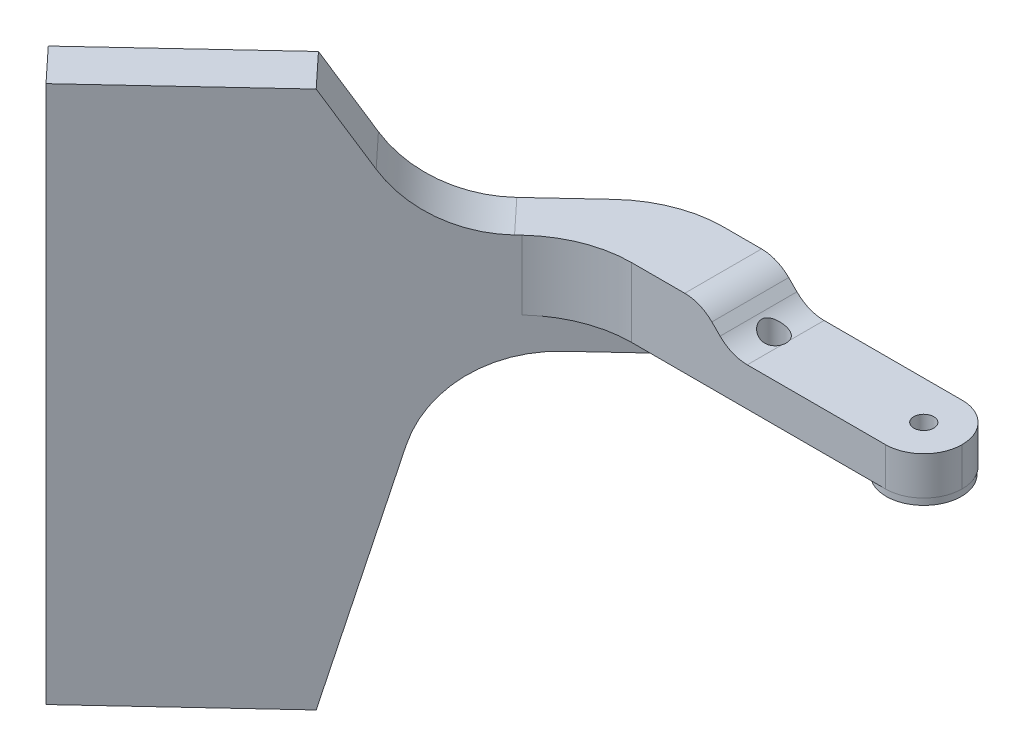
ISO-10303-21;
HEADER;
FILE_DESCRIPTION(('STEP AP214'),'2;1');
FILE_NAME('part.step','',(''),(''),'','','');
FILE_SCHEMA(('AUTOMOTIVE_DESIGN { 1 0 10303 214 1 1 1 1 }'));
ENDSEC;
DATA;
#1=APPLICATION_CONTEXT('core data for automotive mechanical design processes');
#2=APPLICATION_PROTOCOL_DEFINITION('international standard','automotive_design',2000,#1);
#3=PRODUCT_CONTEXT('',#1,'mechanical');
#4=PRODUCT('Part','Part','',(#3));
#5=PRODUCT_RELATED_PRODUCT_CATEGORY('part','',(#4));
#6=PRODUCT_DEFINITION_FORMATION('','',#4);
#7=PRODUCT_DEFINITION_CONTEXT('part definition',#1,'design');
#8=PRODUCT_DEFINITION('design','',#6,#7);
#9=PRODUCT_DEFINITION_SHAPE('','',#8);
#10=(LENGTH_UNIT() NAMED_UNIT(*) SI_UNIT(.MILLI.,.METRE.));
#11=(NAMED_UNIT(*) PLANE_ANGLE_UNIT() SI_UNIT($,.RADIAN.));
#12=(NAMED_UNIT(*) SI_UNIT($,.STERADIAN.) SOLID_ANGLE_UNIT());
#13=UNCERTAINTY_MEASURE_WITH_UNIT(LENGTH_MEASURE(1.E-05),#10,'distance_accuracy_value','');
#14=(GEOMETRIC_REPRESENTATION_CONTEXT(3) GLOBAL_UNCERTAINTY_ASSIGNED_CONTEXT((#13)) GLOBAL_UNIT_ASSIGNED_CONTEXT((#10,
#11,#12)) REPRESENTATION_CONTEXT('',''));
#15=CARTESIAN_POINT('',(0.,0.,0.));
#16=DIRECTION('',(0.,0.,1.));
#17=DIRECTION('',(1.,0.,0.));
#18=AXIS2_PLACEMENT_3D('',#15,#16,#17);
#19=CARTESIAN_POINT('',(0.,0.,0.));
#20=DIRECTION('',(0.,1.,0.));
#21=DIRECTION('',(0.,0.,1.));
#22=AXIS2_PLACEMENT_3D('',#19,#20,#21);
#23=PLANE('',#22);
#24=CARTESIAN_POINT('',(17.5,0.,-5.00000000000005));
#25=DIRECTION('',(0.,-1.,0.));
#26=DIRECTION('',(0.,0.,-1.));
#27=AXIS2_PLACEMENT_3D('',#24,#25,#26);
#28=CIRCLE('',#27,1.6);
#29=CARTESIAN_POINT('',(17.5,0.,-6.60000000000005));
#30=VERTEX_POINT('',#29);
#31=EDGE_CURVE('E196',#30,#30,#28,.T.);
#32=ORIENTED_EDGE('',*,*,#31,.F.);
#33=EDGE_LOOP('',(#32));
#34=FACE_BOUND('',#33,.T.);
#35=CARTESIAN_POINT('',(37.,0.,-4.99999999999999));
#36=DIRECTION('',(0.,1.,0.));
#37=DIRECTION('',(0.,0.,1.));
#38=AXIS2_PLACEMENT_3D('',#35,#36,#37);
#39=CIRCLE('',#38,4.9);
#40=CARTESIAN_POINT('',(37.,0.,-0.0999999999999873));
#41=VERTEX_POINT('',#40);
#42=EDGE_CURVE('E247',#41,#41,#39,.F.);
#43=ORIENTED_EDGE('',*,*,#42,.F.);
#44=EDGE_LOOP('',(#43));
#45=FACE_BOUND('',#44,.T.);
#46=DIRECTION('',(-0.731353701619174,0.,0.681998360062495));
#47=VECTOR('',#46,1.);
#48=CARTESIAN_POINT('',(-15.5899264830256,0.,12.7418064037898));
#49=LINE('',#48,#47);
#50=CARTESIAN_POINT('',(8.79767511383777,0.,-10.));
#51=VERTEX_POINT('',#50);
#52=CARTESIAN_POINT('',(-6.24733025312248,0.,4.02969447571239));
#53=VERTEX_POINT('',#52);
#54=EDGE_CURVE('E329',#51,#53,#49,.T.);
#55=ORIENTED_EDGE('',*,*,#54,.F.);
#56=DIRECTION('',(1.,0.,0.));
#57=VECTOR('',#56,1.);
#58=CARTESIAN_POINT('',(0.,0.,-10.));
#59=LINE('',#58,#57);
#60=CARTESIAN_POINT('',(37.,0.,-10.));
#61=VERTEX_POINT('',#60);
#62=EDGE_CURVE('E225',#51,#61,#59,.T.);
#63=ORIENTED_EDGE('',*,*,#62,.T.);
#64=CARTESIAN_POINT('',(37.,0.,-5.));
#65=DIRECTION('',(0.,1.,0.));
#66=DIRECTION('',(0.,0.,1.));
#67=AXIS2_PLACEMENT_3D('',#64,#65,#66);
#68=CIRCLE('',#67,5.);
#69=CARTESIAN_POINT('',(42.,0.,-5.));
#70=VERTEX_POINT('',#69);
#71=EDGE_CURVE('E235',#61,#70,#68,.F.);
#72=ORIENTED_EDGE('',*,*,#71,.T.);
#73=CARTESIAN_POINT('',(37.,0.,-5.00000000000001));
#74=DIRECTION('',(0.,1.,0.));
#75=DIRECTION('',(0.,0.,1.));
#76=AXIS2_PLACEMENT_3D('',#73,#74,#75);
#77=CIRCLE('',#76,5.);
#78=CARTESIAN_POINT('',(37.,0.,0.));
#79=VERTEX_POINT('',#78);
#80=EDGE_CURVE('E237',#70,#79,#77,.F.);
#81=ORIENTED_EDGE('',*,*,#80,.T.);
#82=DIRECTION('',(-1.,0.,0.));
#83=VECTOR('',#82,1.);
#84=CARTESIAN_POINT('',(0.,0.,0.));
#85=LINE('',#84,#83);
#86=CARTESIAN_POINT('',(3.98264514781494,0.,0.));
#87=VERTEX_POINT('',#86);
#88=EDGE_CURVE('E229',#79,#87,#85,.T.);
#89=ORIENTED_EDGE('',*,*,#88,.T.);
#90=CARTESIAN_POINT('',(3.98264514781494,0.,15.));
#91=DIRECTION('',(0.,1.,0.));
#92=DIRECTION('',(0.,0.,1.));
#93=AXIS2_PLACEMENT_3D('',#90,#91,#92);
#94=CIRCLE('',#93,15.);
#95=EDGE_CURVE('E278',#87,#53,#94,.T.);
#96=ORIENTED_EDGE('',*,*,#95,.T.);
#97=EDGE_LOOP('',(#55,#63,#72,#81,#89,#96));
#98=FACE_BOUND('',#97,.T.);
#99=ADVANCED_FACE('F40',(#34,#45,#98),#23,.F.);
#100=CARTESIAN_POINT('',(-11.0535847060781,0.,8.51159926090981));
#101=DIRECTION('',(0.705053553573808,-0.265760497297975,-0.657473075242537));
#102=DIRECTION('',(-0.681998360062495,0.,-0.731353701619174));
#103=AXIS2_PLACEMENT_3D('',#100,#101,#102);
#104=PLANE('',#103);
#105=DIRECTION('',(-0.194364923443027,-0.964039085346612,0.181248223326612));
#106=VECTOR('',#105,1.);
#107=CARTESIAN_POINT('',(-15.1455748664531,0.,4.12347705119476));
#108=LINE('',#107,#106);
#109=CARTESIAN_POINT('',(-18.1725431803942,-15.0135925405304,6.94617066920552));
#110=VERTEX_POINT('',#109);
#111=CARTESIAN_POINT('',(-24.2182584203481,-45.,12.5838913369548));
#112=VERTEX_POINT('',#111);
#113=EDGE_CURVE('E351',#110,#112,#108,.T.);
#114=ORIENTED_EDGE('',*,*,#113,.F.);
#115=DIRECTION('',(0.681998360062495,0.,0.731353701619174));
#116=VECTOR('',#115,1.);
#117=CARTESIAN_POINT('',(-14.0805530200192,-15.0135925405304,11.3342928789206));
#118=LINE('',#117,#116);
#119=CARTESIAN_POINT('',(-14.0805530200192,-15.0135925405304,11.3342928789206));
#120=VERTEX_POINT('',#119);
#121=EDGE_CURVE('E273',#110,#120,#118,.T.);
#122=ORIENTED_EDGE('',*,*,#121,.T.);
#123=DIRECTION('',(-0.194364923443027,-0.964039085346612,0.181248223326612));
#124=VECTOR('',#123,1.);
#125=CARTESIAN_POINT('',(-11.0535847060781,0.,8.51159926090981));
#126=LINE('',#125,#124);
#127=CARTESIAN_POINT('',(-20.1262682599731,-45.,16.9720135466699));
#128=VERTEX_POINT('',#127);
#129=EDGE_CURVE('E354',#120,#128,#126,.T.);
#130=ORIENTED_EDGE('',*,*,#129,.T.);
#131=DIRECTION('',(0.681998360062494,0.,0.731353701619174));
#132=VECTOR('',#131,1.);
#133=CARTESIAN_POINT('',(-20.1262682599731,-45.,16.9720135466699));
#134=LINE('',#133,#132);
#135=EDGE_CURVE('E360',#112,#128,#134,.T.);
#136=ORIENTED_EDGE('',*,*,#135,.F.);
#137=EDGE_LOOP('',(#114,#122,#130,#136));
#138=FACE_BOUND('',#137,.T.);
#139=ADVANCED_FACE('F403',(#138),#104,.T.);
#140=CARTESIAN_POINT('',(0.,5.,0.));
#141=DIRECTION('',(0.,0.,1.));
#142=DIRECTION('',(1.,0.,0.));
#143=AXIS2_PLACEMENT_3D('',#140,#141,#142);
#144=PLANE('',#143);
#145=DIRECTION('',(0.707106781186548,-0.707106781186547,0.));
#146=VECTOR('',#145,1.);
#147=CARTESIAN_POINT('',(8.4752602127433,13.4752602127433,0.));
#148=LINE('',#147,#146);
#149=CARTESIAN_POINT('',(15.4860543314193,6.46446609406726,0.));
#150=VERTEX_POINT('',#149);
#151=CARTESIAN_POINT('',(14.4149865195539,7.53553390593273,0.));
#152=VERTEX_POINT('',#151);
#153=EDGE_CURVE('E291',#150,#152,#148,.F.);
#154=ORIENTED_EDGE('',*,*,#153,.T.);
#155=CARTESIAN_POINT('',(10.8794526136211,4.,0.));
#156=DIRECTION('',(0.,0.,1.));
#157=DIRECTION('',(1.,0.,0.));
#158=AXIS2_PLACEMENT_3D('',#155,#156,#157);
#159=CIRCLE('',#158,5.);
#160=CARTESIAN_POINT('',(10.8794526136211,9.,0.));
#161=VERTEX_POINT('',#160);
#162=EDGE_CURVE('E201',#152,#161,#159,.T.);
#163=ORIENTED_EDGE('',*,*,#162,.T.);
#164=DIRECTION('',(1.,0.,0.));
#165=VECTOR('',#164,1.);
#166=CARTESIAN_POINT('',(0.,9.,0.));
#167=LINE('',#166,#165);
#168=CARTESIAN_POINT('',(3.98264514781494,9.,0.));
#169=VERTEX_POINT('',#168);
#170=EDGE_CURVE('E315',#169,#161,#167,.T.);
#171=ORIENTED_EDGE('',*,*,#170,.F.);
#172=DIRECTION('',(0.,-1.,0.));
#173=VECTOR('',#172,1.);
#174=CARTESIAN_POINT('',(3.98264514781494,5.,0.));
#175=LINE('',#174,#173);
#176=EDGE_CURVE('E268',#169,#87,#175,.T.);
#177=ORIENTED_EDGE('',*,*,#176,.T.);
#178=ORIENTED_EDGE('',*,*,#88,.F.);
#179=DIRECTION('',(0.,-1.,0.));
#180=VECTOR('',#179,1.);
#181=CARTESIAN_POINT('',(37.,5.,0.));
#182=LINE('',#181,#180);
#183=CARTESIAN_POINT('',(37.,5.,0.));
#184=VERTEX_POINT('',#183);
#185=EDGE_CURVE('E239',#79,#184,#182,.F.);
#186=ORIENTED_EDGE('',*,*,#185,.T.);
#187=DIRECTION('',(-1.,0.,0.));
#188=VECTOR('',#187,1.);
#189=CARTESIAN_POINT('',(0.,5.,0.));
#190=LINE('',#189,#188);
#191=CARTESIAN_POINT('',(19.0215882373521,5.,0.));
#192=VERTEX_POINT('',#191);
#193=EDGE_CURVE('E221',#184,#192,#190,.T.);
#194=ORIENTED_EDGE('',*,*,#193,.T.);
#195=CARTESIAN_POINT('',(19.0215882373521,10.,0.));
#196=DIRECTION('',(0.,0.,1.));
#197=DIRECTION('',(1.,0.,0.));
#198=AXIS2_PLACEMENT_3D('',#195,#196,#197);
#199=CIRCLE('',#198,5.);
#200=EDGE_CURVE('E199',#192,#150,#199,.F.);
#201=ORIENTED_EDGE('',*,*,#200,.T.);
#202=EDGE_LOOP('',(#154,#163,#171,#177,#178,#186,#194,#201));
#203=FACE_BOUND('',#202,.T.);
#204=ADVANCED_FACE('F308',(#203),#144,.T.);
#205=CARTESIAN_POINT('',(0.,5.,-10.));
#206=DIRECTION('',(0.,0.,-1.));
#207=DIRECTION('',(-1.,0.,0.));
#208=AXIS2_PLACEMENT_3D('',#205,#206,#207);
#209=PLANE('',#208);
#210=DIRECTION('',(-1.,0.,0.));
#211=VECTOR('',#210,1.);
#212=CARTESIAN_POINT('',(0.,9.,-10.));
#213=LINE('',#212,#211);
#214=CARTESIAN_POINT('',(10.8794526136211,9.,-10.));
#215=VERTEX_POINT('',#214);
#216=CARTESIAN_POINT('',(5.90865713422409,9.,-10.));
#217=VERTEX_POINT('',#216);
#218=EDGE_CURVE('E195',#215,#217,#213,.T.);
#219=ORIENTED_EDGE('',*,*,#218,.F.);
#220=CARTESIAN_POINT('',(10.8794526136211,4.,-10.));
#221=DIRECTION('',(0.,0.,-1.));
#222=DIRECTION('',(-1.,0.,0.));
#223=AXIS2_PLACEMENT_3D('',#220,#221,#222);
#224=CIRCLE('',#223,5.);
#225=CARTESIAN_POINT('',(14.4149865195539,7.53553390593273,-10.));
#226=VERTEX_POINT('',#225);
#227=EDGE_CURVE('E298',#215,#226,#224,.T.);
#228=ORIENTED_EDGE('',*,*,#227,.T.);
#229=DIRECTION('',(-0.707106781186548,0.707106781186547,0.));
#230=VECTOR('',#229,1.);
#231=CARTESIAN_POINT('',(8.4752602127433,13.4752602127433,-10.));
#232=LINE('',#231,#230);
#233=CARTESIAN_POINT('',(15.4860543314193,6.46446609406726,-10.));
#234=VERTEX_POINT('',#233);
#235=EDGE_CURVE('E216',#226,#234,#232,.F.);
#236=ORIENTED_EDGE('',*,*,#235,.T.);
#237=CARTESIAN_POINT('',(19.0215882373521,10.,-10.));
#238=DIRECTION('',(0.,0.,-1.));
#239=DIRECTION('',(-1.,0.,0.));
#240=AXIS2_PLACEMENT_3D('',#237,#238,#239);
#241=CIRCLE('',#240,5.);
#242=CARTESIAN_POINT('',(19.0215882373521,5.,-10.));
#243=VERTEX_POINT('',#242);
#244=EDGE_CURVE('E54',#234,#243,#241,.F.);
#245=ORIENTED_EDGE('',*,*,#244,.T.);
#246=DIRECTION('',(1.,0.,0.));
#247=VECTOR('',#246,1.);
#248=CARTESIAN_POINT('',(0.,5.,-10.));
#249=LINE('',#248,#247);
#250=CARTESIAN_POINT('',(37.,5.,-10.));
#251=VERTEX_POINT('',#250);
#252=EDGE_CURVE('E213',#243,#251,#249,.T.);
#253=ORIENTED_EDGE('',*,*,#252,.T.);
#254=DIRECTION('',(0.,-1.,0.));
#255=VECTOR('',#254,1.);
#256=CARTESIAN_POINT('',(37.,0.,-10.));
#257=LINE('',#256,#255);
#258=EDGE_CURVE('E245',#251,#61,#257,.T.);
#259=ORIENTED_EDGE('',*,*,#258,.T.);
#260=ORIENTED_EDGE('',*,*,#62,.F.);
#261=DIRECTION('',(0.,1.,0.));
#262=VECTOR('',#261,1.);
#263=CARTESIAN_POINT('',(8.79767511383777,-4.,-10.));
#264=LINE('',#263,#262);
#265=CARTESIAN_POINT('',(8.79767511383777,-4.,-10.));
#266=VERTEX_POINT('',#265);
#267=EDGE_CURVE('E338',#266,#51,#264,.T.);
#268=ORIENTED_EDGE('',*,*,#267,.F.);
#269=DIRECTION('',(1.,0.,0.));
#270=VECTOR('',#269,1.);
#271=CARTESIAN_POINT('',(8.79767511383777,-4.,-10.));
#272=LINE('',#271,#270);
#273=CARTESIAN_POINT('',(5.90865713422409,-4.,-10.));
#274=VERTEX_POINT('',#273);
#275=EDGE_CURVE('E330',#274,#266,#272,.T.);
#276=ORIENTED_EDGE('',*,*,#275,.F.);
#277=DIRECTION('',(0.,-1.,0.));
#278=VECTOR('',#277,1.);
#279=CARTESIAN_POINT('',(5.90865713422409,9.,-10.));
#280=LINE('',#279,#278);
#281=EDGE_CURVE('E260',#274,#217,#280,.F.);
#282=ORIENTED_EDGE('',*,*,#281,.T.);
#283=EDGE_LOOP('',(#219,#228,#236,#245,#253,#259,#260,#268,#276,#282));
#284=FACE_BOUND('',#283,.T.);
#285=ADVANCED_FACE('F211',(#284),#209,.T.);
#286=CARTESIAN_POINT('',(-4.98782025129912,5.,-5.34878236872068));
#287=DIRECTION('',(0.681998360062495,0.,0.731353701619174));
#288=DIRECTION('',(0.731353701619174,0.,-0.681998360062495));
#289=AXIS2_PLACEMENT_3D('',#286,#287,#288);
#290=PLANE('',#289);
#291=DIRECTION('',(-0.731353701619174,0.,0.681998360062495));
#292=VECTOR('',#291,1.);
#293=CARTESIAN_POINT('',(-4.98782025129912,9.,-5.34878236872068));
#294=LINE('',#293,#292);
#295=CARTESIAN_POINT('',(-4.32131826671333,9.,-5.97030552428761));
#296=VERTEX_POINT('',#295);
#297=CARTESIAN_POINT('',(-10.8553641588959,9.,0.122790843688388));
#298=VERTEX_POINT('',#297);
#299=EDGE_CURVE('E319',#296,#298,#294,.T.);
#300=ORIENTED_EDGE('',*,*,#299,.F.);
#301=DIRECTION('',(0.,-1.,0.));
#302=VECTOR('',#301,1.);
#303=CARTESIAN_POINT('',(-4.32131826671333,-4.,-5.97030552428761));
#304=LINE('',#303,#302);
#305=CARTESIAN_POINT('',(-4.32131826671333,-4.,-5.97030552428761));
#306=VERTEX_POINT('',#305);
#307=EDGE_CURVE('E253',#296,#306,#304,.T.);
#308=ORIENTED_EDGE('',*,*,#307,.T.);
#309=DIRECTION('',(0.731353701619174,0.,-0.681998360062495));
#310=VECTOR('',#309,1.);
#311=CARTESIAN_POINT('',(0.,-4.,-10.));
#312=LINE('',#311,#310);
#313=CARTESIAN_POINT('',(-7.5967398767871,-4.,-2.91592545943254));
#314=VERTEX_POINT('',#313);
#315=EDGE_CURVE('E335',#314,#306,#312,.T.);
#316=ORIENTED_EDGE('',*,*,#315,.F.);
#317=CARTESIAN_POINT('',(-7.5967398767871,-19.,-2.91592545943254));
#318=DIRECTION('',(0.681998360062495,0.,0.731353701619174));
#319=DIRECTION('',(0.731353701619174,0.,-0.681998360062495));
#320=AXIS2_PLACEMENT_3D('',#317,#318,#319);
#321=CIRCLE('',#320,15.);
#322=EDGE_CURVE('E285',#314,#110,#321,.T.);
#323=ORIENTED_EDGE('',*,*,#322,.T.);
#324=ORIENTED_EDGE('',*,*,#113,.T.);
#325=DIRECTION('',(0.731353701619174,0.,-0.681998360062495));
#326=VECTOR('',#325,1.);
#327=CARTESIAN_POINT('',(-24.2182584203481,-45.,12.5838913369548));
#328=LINE('',#327,#326);
#329=CARTESIAN_POINT('',(-42.4185146939121,-45.,29.5559048836247));
#330=VERTEX_POINT('',#329);
#331=EDGE_CURVE('E356',#330,#112,#328,.T.);
#332=ORIENTED_EDGE('',*,*,#331,.F.);
#333=DIRECTION('',(0.,-1.,0.));
#334=VECTOR('',#333,1.);
#335=CARTESIAN_POINT('',(-42.4185146939121,5.,29.5559048836247));
#336=LINE('',#335,#334);
#337=CARTESIAN_POINT('',(-42.4185146939121,25.,29.5559048836247));
#338=VERTEX_POINT('',#337);
#339=EDGE_CURVE('E223',#338,#330,#336,.T.);
#340=ORIENTED_EDGE('',*,*,#339,.F.);
#341=DIRECTION('',(-0.731353701619174,0.,0.681998360062495));
#342=VECTOR('',#341,1.);
#343=CARTESIAN_POINT('',(-24.2182584203481,25.,12.5838913369548));
#344=LINE('',#343,#342);
#345=CARTESIAN_POINT('',(-24.2182584203481,25.,12.5838913369548));
#346=VERTEX_POINT('',#345);
#347=EDGE_CURVE('E369',#346,#338,#344,.T.);
#348=ORIENTED_EDGE('',*,*,#347,.F.);
#349=DIRECTION('',(0.385498897170092,-0.84980126305539,-0.359483537300538));
#350=VECTOR('',#349,1.);
#351=CARTESIAN_POINT('',(-15.1455748664531,5.,4.12347705119476));
#352=LINE('',#351,#350);
#353=CARTESIAN_POINT('',(-20.177943649539,16.0934515751417,8.81623686043057));
#354=VERTEX_POINT('',#353);
#355=EDGE_CURVE('E347',#346,#354,#352,.T.);
#356=ORIENTED_EDGE('',*,*,#355,.T.);
#357=CARTESIAN_POINT('',(-10.8553641588959,24.,0.122790843688387));
#358=DIRECTION('',(0.681998360062495,0.,0.731353701619174));
#359=DIRECTION('',(0.731353701619174,0.,-0.681998360062495));
#360=AXIS2_PLACEMENT_3D('',#357,#358,#359);
#361=CIRCLE('',#360,15.);
#362=EDGE_CURVE('E289',#354,#298,#361,.T.);
#363=ORIENTED_EDGE('',*,*,#362,.T.);
#364=EDGE_LOOP('',(#300,#308,#316,#323,#324,#332,#340,#348,#356,#363));
#365=FACE_BOUND('',#364,.T.);
#366=ADVANCED_FACE('F416',(#365),#290,.F.);
#367=CARTESIAN_POINT('',(-37.430694442613,5.,34.9046872523454));
#368=DIRECTION('',(0.731353701619174,0.,-0.681998360062495));
#369=DIRECTION('',(-0.681998360062495,0.,-0.731353701619174));
#370=AXIS2_PLACEMENT_3D('',#367,#368,#369);
#371=PLANE('',#370);
#372=ORIENTED_EDGE('',*,*,#339,.T.);
#373=DIRECTION('',(-0.681998360062496,0.,-0.731353701619173));
#374=VECTOR('',#373,1.);
#375=CARTESIAN_POINT('',(-42.4185146939121,-45.,29.5559048836247));
#376=LINE('',#375,#374);
#377=CARTESIAN_POINT('',(-38.3265245335371,-45.,33.9440270933397));
#378=VERTEX_POINT('',#377);
#379=EDGE_CURVE('E366',#378,#330,#376,.T.);
#380=ORIENTED_EDGE('',*,*,#379,.F.);
#381=DIRECTION('',(0.,-1.,0.));
#382=VECTOR('',#381,1.);
#383=CARTESIAN_POINT('',(-38.3265245335371,5.,33.9440270933397));
#384=LINE('',#383,#382);
#385=CARTESIAN_POINT('',(-38.3265245335371,25.,33.9440270933397));
#386=VERTEX_POINT('',#385);
#387=EDGE_CURVE('E220',#386,#378,#384,.T.);
#388=ORIENTED_EDGE('',*,*,#387,.F.);
#389=DIRECTION('',(0.681998360062496,0.,0.731353701619173));
#390=VECTOR('',#389,1.);
#391=CARTESIAN_POINT('',(-42.4185146939121,25.,29.5559048836247));
#392=LINE('',#391,#390);
#393=EDGE_CURVE('E372',#338,#386,#392,.T.);
#394=ORIENTED_EDGE('',*,*,#393,.F.);
#395=EDGE_LOOP('',(#372,#380,#388,#394));
#396=FACE_BOUND('',#395,.T.);
#397=ADVANCED_FACE('F398',(#396),#371,.F.);
#398=CARTESIAN_POINT('',(-0.895830090924156,5.,-0.960660159005641));
#399=DIRECTION('',(-0.681998360062495,0.,-0.731353701619174));
#400=DIRECTION('',(-0.731353701619174,0.,0.681998360062495));
#401=AXIS2_PLACEMENT_3D('',#398,#399,#400);
#402=PLANE('',#401);
#403=ORIENTED_EDGE('',*,*,#54,.T.);
#404=DIRECTION('',(0.,-1.,0.));
#405=VECTOR('',#404,1.);
#406=CARTESIAN_POINT('',(-6.24733025312248,5.,4.02969447571239));
#407=LINE('',#406,#405);
#408=CARTESIAN_POINT('',(-6.24733025312248,9.,4.02969447571239));
#409=VERTEX_POINT('',#408);
#410=EDGE_CURVE('E271',#53,#409,#407,.F.);
#411=ORIENTED_EDGE('',*,*,#410,.T.);
#412=DIRECTION('',(0.731353701619174,0.,-0.681998360062495));
#413=VECTOR('',#412,1.);
#414=CARTESIAN_POINT('',(-0.895830090924156,9.,-0.960660159005641));
#415=LINE('',#414,#413);
#416=CARTESIAN_POINT('',(-6.76337399852093,9.,4.51091305340342));
#417=VERTEX_POINT('',#416);
#418=EDGE_CURVE('E322',#417,#409,#415,.T.);
#419=ORIENTED_EDGE('',*,*,#418,.F.);
#420=CARTESIAN_POINT('',(-6.76337399852093,24.,4.51091305340342));
#421=DIRECTION('',(-0.681998360062495,0.,-0.731353701619174));
#422=DIRECTION('',(-0.731353701619174,0.,0.681998360062495));
#423=AXIS2_PLACEMENT_3D('',#420,#421,#422);
#424=CIRCLE('',#423,15.);
#425=CARTESIAN_POINT('',(-16.0859534891641,16.0934515751417,13.2043590701456));
#426=VERTEX_POINT('',#425);
#427=EDGE_CURVE('E287',#417,#426,#424,.T.);
#428=ORIENTED_EDGE('',*,*,#427,.T.);
#429=DIRECTION('',(0.385498897170092,-0.84980126305539,-0.359483537300538));
#430=VECTOR('',#429,1.);
#431=CARTESIAN_POINT('',(-11.0535847060781,5.,8.51159926090981));
#432=LINE('',#431,#430);
#433=CARTESIAN_POINT('',(-20.1262682599731,25.,16.9720135466699));
#434=VERTEX_POINT('',#433);
#435=EDGE_CURVE('E348',#434,#426,#432,.T.);
#436=ORIENTED_EDGE('',*,*,#435,.F.);
#437=DIRECTION('',(0.731353701619174,0.,-0.681998360062495));
#438=VECTOR('',#437,1.);
#439=CARTESIAN_POINT('',(-38.3265245335371,25.,33.9440270933397));
#440=LINE('',#439,#438);
#441=EDGE_CURVE('E375',#386,#434,#440,.T.);
#442=ORIENTED_EDGE('',*,*,#441,.F.);
#443=ORIENTED_EDGE('',*,*,#387,.T.);
#444=DIRECTION('',(-0.731353701619174,0.,0.681998360062494));
#445=VECTOR('',#444,1.);
#446=CARTESIAN_POINT('',(-38.3265245335371,-45.,33.9440270933397));
#447=LINE('',#446,#445);
#448=EDGE_CURVE('E363',#128,#378,#447,.T.);
#449=ORIENTED_EDGE('',*,*,#448,.F.);
#450=ORIENTED_EDGE('',*,*,#129,.F.);
#451=CARTESIAN_POINT('',(-3.50474971641214,-19.,1.4721967502825));
#452=DIRECTION('',(-0.681998360062495,0.,-0.731353701619174));
#453=DIRECTION('',(-0.731353701619174,0.,0.681998360062495));
#454=AXIS2_PLACEMENT_3D('',#451,#452,#453);
#455=CIRCLE('',#454,15.);
#456=CARTESIAN_POINT('',(-3.50474971641213,-4.,1.47219675028249));
#457=VERTEX_POINT('',#456);
#458=EDGE_CURVE('E283',#120,#457,#455,.T.);
#459=ORIENTED_EDGE('',*,*,#458,.T.);
#460=DIRECTION('',(-0.731353701619174,0.,0.681998360062495));
#461=VECTOR('',#460,1.);
#462=CARTESIAN_POINT('',(-15.5899264830256,-4.,12.7418064037898));
#463=LINE('',#462,#461);
#464=EDGE_CURVE('E332',#266,#457,#463,.T.);
#465=ORIENTED_EDGE('',*,*,#464,.F.);
#466=ORIENTED_EDGE('',*,*,#267,.T.);
#467=EDGE_LOOP('',(#403,#411,#419,#428,#436,#442,#443,#449,#450,#459,#465,#466));
#468=FACE_BOUND('',#467,.T.);
#469=ADVANCED_FACE('F387',(#468),#402,.F.);
#470=CARTESIAN_POINT('',(0.,5.,0.));
#471=DIRECTION('',(0.,1.,0.));
#472=DIRECTION('',(0.,0.,1.));
#473=AXIS2_PLACEMENT_3D('',#470,#471,#472);
#474=PLANE('',#473);
#475=CARTESIAN_POINT('',(17.5,5.,-5.00000000000005));
#476=DIRECTION('',(0.,1.,0.));
#477=DIRECTION('',(0.,0.,1.));
#478=AXIS2_PLACEMENT_3D('',#475,#476,#477);
#479=CIRCLE('',#478,1.6);
#480=CARTESIAN_POINT('',(19.0215882373521,5.,-4.50525841497637));
#481=VERTEX_POINT('',#480);
#482=CARTESIAN_POINT('',(19.0215882373521,5.,-5.49474158502373));
#483=VERTEX_POINT('',#482);
#484=EDGE_CURVE('E60',#481,#483,#479,.T.);
#485=ORIENTED_EDGE('',*,*,#484,.F.);
#486=DIRECTION('',(0.,0.,-1.));
#487=VECTOR('',#486,1.);
#488=CARTESIAN_POINT('',(19.0215882373521,5.,0.));
#489=LINE('',#488,#487);
#490=EDGE_CURVE('E66',#481,#192,#489,.F.);
#491=ORIENTED_EDGE('',*,*,#490,.T.);
#492=ORIENTED_EDGE('',*,*,#193,.F.);
#493=CARTESIAN_POINT('',(37.,5.,-5.00000000000001));
#494=DIRECTION('',(0.,1.,0.));
#495=DIRECTION('',(0.,0.,1.));
#496=AXIS2_PLACEMENT_3D('',#493,#494,#495);
#497=CIRCLE('',#496,5.);
#498=CARTESIAN_POINT('',(42.,5.,-5.));
#499=VERTEX_POINT('',#498);
#500=EDGE_CURVE('E243',#184,#499,#497,.T.);
#501=ORIENTED_EDGE('',*,*,#500,.T.);
#502=CARTESIAN_POINT('',(37.,5.,-5.));
#503=DIRECTION('',(0.,1.,0.));
#504=DIRECTION('',(0.,0.,1.));
#505=AXIS2_PLACEMENT_3D('',#502,#503,#504);
#506=CIRCLE('',#505,5.);
#507=EDGE_CURVE('E218',#499,#251,#506,.T.);
#508=ORIENTED_EDGE('',*,*,#507,.T.);
#509=ORIENTED_EDGE('',*,*,#252,.F.);
#510=EDGE_CURVE('E194',#243,#483,#489,.F.);
#511=ORIENTED_EDGE('',*,*,#510,.T.);
#512=EDGE_LOOP('',(#485,#491,#492,#501,#508,#509,#511));
#513=FACE_BOUND('',#512,.T.);
#514=CARTESIAN_POINT('',(37.,5.,-4.99999999999999));
#515=DIRECTION('',(0.,1.,0.));
#516=DIRECTION('',(0.,0.,1.));
#517=AXIS2_PLACEMENT_3D('',#514,#515,#516);
#518=CIRCLE('',#517,1.29999999999999);
#519=CARTESIAN_POINT('',(37.,5.,-3.69999999999999));
#520=VERTEX_POINT('',#519);
#521=EDGE_CURVE('E250',#520,#520,#518,.T.);
#522=ORIENTED_EDGE('',*,*,#521,.F.);
#523=EDGE_LOOP('',(#522));
#524=FACE_BOUND('',#523,.T.);
#525=ADVANCED_FACE('F191',(#513,#524),#474,.T.);
#526=CARTESIAN_POINT('',(37.,5.,-5.));
#527=DIRECTION('',(0.,1.,0.));
#528=DIRECTION('',(0.,0.,1.));
#529=AXIS2_PLACEMENT_3D('',#526,#527,#528);
#530=CYLINDRICAL_SURFACE('',#529,5.);
#531=ORIENTED_EDGE('',*,*,#258,.F.);
#532=ORIENTED_EDGE('',*,*,#507,.F.);
#533=DIRECTION('',(0.,-1.,0.));
#534=VECTOR('',#533,1.);
#535=CARTESIAN_POINT('',(42.,5.,-5.));
#536=LINE('',#535,#534);
#537=EDGE_CURVE('E232',#70,#499,#536,.F.);
#538=ORIENTED_EDGE('',*,*,#537,.F.);
#539=ORIENTED_EDGE('',*,*,#71,.F.);
#540=EDGE_LOOP('',(#531,#532,#538,#539));
#541=FACE_BOUND('',#540,.T.);
#542=ADVANCED_FACE('F386',(#541),#530,.T.);
#543=CARTESIAN_POINT('',(37.,5.,-5.00000000000001));
#544=DIRECTION('',(0.,1.,0.));
#545=DIRECTION('',(0.,0.,1.));
#546=AXIS2_PLACEMENT_3D('',#543,#544,#545);
#547=CYLINDRICAL_SURFACE('',#546,5.);
#548=ORIENTED_EDGE('',*,*,#500,.F.);
#549=ORIENTED_EDGE('',*,*,#185,.F.);
#550=ORIENTED_EDGE('',*,*,#80,.F.);
#551=ORIENTED_EDGE('',*,*,#537,.T.);
#552=EDGE_LOOP('',(#548,#549,#550,#551));
#553=FACE_BOUND('',#552,.T.);
#554=ADVANCED_FACE('F394',(#553),#547,.T.);
#555=CARTESIAN_POINT('',(37.,-5.,-4.99999999999999));
#556=DIRECTION('',(0.,1.,0.));
#557=DIRECTION('',(0.,0.,1.));
#558=AXIS2_PLACEMENT_3D('',#555,#556,#557);
#559=CYLINDRICAL_SURFACE('',#558,1.29999999999999);
#560=ORIENTED_EDGE('',*,*,#521,.T.);
#561=EDGE_LOOP('',(#560));
#562=FACE_BOUND('',#561,.T.);
#563=CARTESIAN_POINT('',(37.,-0.9,-4.99999999999999));
#564=DIRECTION('',(0.,-1.,0.));
#565=DIRECTION('',(0.,0.,-1.));
#566=AXIS2_PLACEMENT_3D('',#563,#564,#565);
#567=CIRCLE('',#566,1.29999999999999);
#568=CARTESIAN_POINT('',(37.,-0.9,-6.29999999999998));
#569=VERTEX_POINT('',#568);
#570=EDGE_CURVE('E341',#569,#569,#567,.T.);
#571=ORIENTED_EDGE('',*,*,#570,.T.);
#572=EDGE_LOOP('',(#571));
#573=FACE_BOUND('',#572,.T.);
#574=ADVANCED_FACE('F383',(#562,#573),#559,.F.);
#575=CARTESIAN_POINT('',(0.,25.,0.));
#576=DIRECTION('',(0.,1.,0.));
#577=DIRECTION('',(0.,0.,1.));
#578=AXIS2_PLACEMENT_3D('',#575,#576,#577);
#579=PLANE('',#578);
#580=ORIENTED_EDGE('',*,*,#347,.T.);
#581=ORIENTED_EDGE('',*,*,#393,.T.);
#582=ORIENTED_EDGE('',*,*,#441,.T.);
#583=DIRECTION('',(-0.681998360062495,0.,-0.731353701619174));
#584=VECTOR('',#583,1.);
#585=CARTESIAN_POINT('',(-20.1262682599731,25.,16.9720135466699));
#586=LINE('',#585,#584);
#587=EDGE_CURVE('E378',#434,#346,#586,.T.);
#588=ORIENTED_EDGE('',*,*,#587,.T.);
#589=EDGE_LOOP('',(#580,#581,#582,#588));
#590=FACE_BOUND('',#589,.T.);
#591=ADVANCED_FACE('F475',(#590),#579,.T.);
#592=CARTESIAN_POINT('',(0.,-45.,0.));
#593=DIRECTION('',(0.,1.,0.));
#594=DIRECTION('',(0.,0.,1.));
#595=AXIS2_PLACEMENT_3D('',#592,#593,#594);
#596=PLANE('',#595);
#597=ORIENTED_EDGE('',*,*,#331,.T.);
#598=ORIENTED_EDGE('',*,*,#135,.T.);
#599=ORIENTED_EDGE('',*,*,#448,.T.);
#600=ORIENTED_EDGE('',*,*,#379,.T.);
#601=EDGE_LOOP('',(#597,#598,#599,#600));
#602=FACE_BOUND('',#601,.T.);
#603=ADVANCED_FACE('F470',(#602),#596,.F.);
#604=CARTESIAN_POINT('',(-11.0535847060781,5.,8.51159926090981));
#605=DIRECTION('',(0.621505299376209,0.527103228323888,-0.579563067782812));
#606=DIRECTION('',(-0.681998360062495,0.,-0.731353701619174));
#607=AXIS2_PLACEMENT_3D('',#604,#605,#606);
#608=PLANE('',#607);
#609=ORIENTED_EDGE('',*,*,#435,.T.);
#610=DIRECTION('',(0.681998360062495,0.,0.731353701619174));
#611=VECTOR('',#610,1.);
#612=CARTESIAN_POINT('',(-20.177943649539,16.0934515751417,8.81623686043057));
#613=LINE('',#612,#611);
#614=EDGE_CURVE('E276',#426,#354,#613,.F.);
#615=ORIENTED_EDGE('',*,*,#614,.T.);
#616=ORIENTED_EDGE('',*,*,#355,.F.);
#617=ORIENTED_EDGE('',*,*,#587,.F.);
#618=EDGE_LOOP('',(#609,#615,#616,#617));
#619=FACE_BOUND('',#618,.T.);
#620=ADVANCED_FACE('F464',(#619),#608,.T.);
#621=CARTESIAN_POINT('',(37.,-0.9,-4.99999999999999));
#622=DIRECTION('',(0.,-1.,0.));
#623=DIRECTION('',(0.,0.,-1.));
#624=AXIS2_PLACEMENT_3D('',#621,#622,#623);
#625=PLANE('',#624);
#626=CARTESIAN_POINT('',(37.,-0.9,-4.99999999999999));
#627=DIRECTION('',(0.,-1.,0.));
#628=DIRECTION('',(0.,0.,-1.));
#629=AXIS2_PLACEMENT_3D('',#626,#627,#628);
#630=CIRCLE('',#629,4.9);
#631=CARTESIAN_POINT('',(37.,-0.9,-9.89999999999999));
#632=VERTEX_POINT('',#631);
#633=EDGE_CURVE('E344',#632,#632,#630,.T.);
#634=ORIENTED_EDGE('',*,*,#633,.T.);
#635=EDGE_LOOP('',(#634));
#636=FACE_BOUND('',#635,.T.);
#637=ORIENTED_EDGE('',*,*,#570,.F.);
#638=EDGE_LOOP('',(#637));
#639=FACE_BOUND('',#638,.T.);
#640=ADVANCED_FACE('F461',(#636,#639),#625,.T.);
#641=CARTESIAN_POINT('',(37.,-0.9,-4.99999999999999));
#642=DIRECTION('',(0.,1.,0.));
#643=DIRECTION('',(0.,0.,1.));
#644=AXIS2_PLACEMENT_3D('',#641,#642,#643);
#645=CYLINDRICAL_SURFACE('',#644,4.9);
#646=ORIENTED_EDGE('',*,*,#633,.F.);
#647=EDGE_LOOP('',(#646));
#648=FACE_BOUND('',#647,.T.);
#649=ORIENTED_EDGE('',*,*,#42,.T.);
#650=EDGE_LOOP('',(#649));
#651=FACE_BOUND('',#650,.T.);
#652=ADVANCED_FACE('F459',(#648,#651),#645,.T.);
#653=CARTESIAN_POINT('',(0.,-4.,0.));
#654=DIRECTION('',(0.,1.,0.));
#655=DIRECTION('',(0.,0.,1.));
#656=AXIS2_PLACEMENT_3D('',#653,#654,#655);
#657=PLANE('',#656);
#658=ORIENTED_EDGE('',*,*,#315,.T.);
#659=CARTESIAN_POINT('',(5.90865713422409,-4.,5.));
#660=DIRECTION('',(0.,1.,0.));
#661=DIRECTION('',(0.,0.,1.));
#662=AXIS2_PLACEMENT_3D('',#659,#660,#661);
#663=CIRCLE('',#662,15.);
#664=EDGE_CURVE('E258',#306,#274,#663,.F.);
#665=ORIENTED_EDGE('',*,*,#664,.T.);
#666=ORIENTED_EDGE('',*,*,#275,.T.);
#667=ORIENTED_EDGE('',*,*,#464,.T.);
#668=DIRECTION('',(0.681998360062495,0.,0.731353701619174));
#669=VECTOR('',#668,1.);
#670=CARTESIAN_POINT('',(-2.60891962548798,-4.,2.43285690928814));
#671=LINE('',#670,#669);
#672=EDGE_CURVE('E256',#457,#314,#671,.F.);
#673=ORIENTED_EDGE('',*,*,#672,.T.);
#674=EDGE_LOOP('',(#658,#665,#666,#667,#673));
#675=FACE_BOUND('',#674,.T.);
#676=ADVANCED_FACE('F456',(#675),#657,.F.);
#677=CARTESIAN_POINT('',(0.,9.,0.));
#678=DIRECTION('',(0.,1.,0.));
#679=DIRECTION('',(0.,0.,1.));
#680=AXIS2_PLACEMENT_3D('',#677,#678,#679);
#681=PLANE('',#680);
#682=ORIENTED_EDGE('',*,*,#170,.T.);
#683=DIRECTION('',(0.,0.,1.));
#684=VECTOR('',#683,1.);
#685=CARTESIAN_POINT('',(10.8794526136211,9.,0.));
#686=LINE('',#685,#684);
#687=EDGE_CURVE('E295',#161,#215,#686,.F.);
#688=ORIENTED_EDGE('',*,*,#687,.T.);
#689=ORIENTED_EDGE('',*,*,#218,.T.);
#690=CARTESIAN_POINT('',(5.90865713422409,9.,5.));
#691=DIRECTION('',(0.,1.,0.));
#692=DIRECTION('',(0.,0.,1.));
#693=AXIS2_PLACEMENT_3D('',#690,#691,#692);
#694=CIRCLE('',#693,15.);
#695=EDGE_CURVE('E266',#217,#296,#694,.T.);
#696=ORIENTED_EDGE('',*,*,#695,.T.);
#697=ORIENTED_EDGE('',*,*,#299,.T.);
#698=DIRECTION('',(0.681998360062495,0.,0.731353701619174));
#699=VECTOR('',#698,1.);
#700=CARTESIAN_POINT('',(-6.76337399852093,9.,4.51091305340343));
#701=LINE('',#700,#699);
#702=EDGE_CURVE('E263',#298,#417,#701,.T.);
#703=ORIENTED_EDGE('',*,*,#702,.T.);
#704=ORIENTED_EDGE('',*,*,#418,.T.);
#705=CARTESIAN_POINT('',(3.98264514781494,9.,15.));
#706=DIRECTION('',(0.,1.,0.));
#707=DIRECTION('',(0.,0.,1.));
#708=AXIS2_PLACEMENT_3D('',#705,#706,#707);
#709=CIRCLE('',#708,15.);
#710=EDGE_CURVE('E281',#409,#169,#709,.F.);
#711=ORIENTED_EDGE('',*,*,#710,.T.);
#712=EDGE_LOOP('',(#682,#688,#689,#696,#697,#703,#704,#711));
#713=FACE_BOUND('',#712,.T.);
#714=ADVANCED_FACE('F314',(#713),#681,.T.);
#715=CARTESIAN_POINT('',(5.90865713422409,5.,5.));
#716=DIRECTION('',(0.,1.,0.));
#717=DIRECTION('',(0.,0.,1.));
#718=AXIS2_PLACEMENT_3D('',#715,#716,#717);
#719=CYLINDRICAL_SURFACE('',#718,15.);
#720=ORIENTED_EDGE('',*,*,#695,.F.);
#721=ORIENTED_EDGE('',*,*,#281,.F.);
#722=ORIENTED_EDGE('',*,*,#664,.F.);
#723=ORIENTED_EDGE('',*,*,#307,.F.);
#724=EDGE_LOOP('',(#720,#721,#722,#723));
#725=FACE_BOUND('',#724,.T.);
#726=ADVANCED_FACE('F428',(#725),#719,.T.);
#727=CARTESIAN_POINT('',(3.98264514781494,5.,15.));
#728=DIRECTION('',(0.,-1.,0.));
#729=DIRECTION('',(0.,0.,-1.));
#730=AXIS2_PLACEMENT_3D('',#727,#728,#729);
#731=CYLINDRICAL_SURFACE('',#730,15.);
#732=ORIENTED_EDGE('',*,*,#710,.F.);
#733=ORIENTED_EDGE('',*,*,#410,.F.);
#734=ORIENTED_EDGE('',*,*,#95,.F.);
#735=ORIENTED_EDGE('',*,*,#176,.F.);
#736=EDGE_LOOP('',(#732,#733,#734,#735));
#737=FACE_BOUND('',#736,.T.);
#738=ADVANCED_FACE('F431',(#737),#731,.F.);
#739=CARTESIAN_POINT('',(-3.50474971641213,-19.,1.4721967502825));
#740=DIRECTION('',(0.681998360062495,0.,0.731353701619174));
#741=DIRECTION('',(0.731353701619174,0.,-0.681998360062495));
#742=AXIS2_PLACEMENT_3D('',#739,#740,#741);
#743=CYLINDRICAL_SURFACE('',#742,15.);
#744=ORIENTED_EDGE('',*,*,#322,.F.);
#745=ORIENTED_EDGE('',*,*,#672,.F.);
#746=ORIENTED_EDGE('',*,*,#458,.F.);
#747=ORIENTED_EDGE('',*,*,#121,.F.);
#748=EDGE_LOOP('',(#744,#745,#746,#747));
#749=FACE_BOUND('',#748,.T.);
#750=ADVANCED_FACE('F435',(#749),#743,.F.);
#751=CARTESIAN_POINT('',(-5.86754390759678,24.,5.47157321240906));
#752=DIRECTION('',(-0.681998360062495,0.,-0.731353701619174));
#753=DIRECTION('',(-0.731353701619174,0.,0.681998360062495));
#754=AXIS2_PLACEMENT_3D('',#751,#752,#753);
#755=CYLINDRICAL_SURFACE('',#754,15.);
#756=ORIENTED_EDGE('',*,*,#362,.F.);
#757=ORIENTED_EDGE('',*,*,#614,.F.);
#758=ORIENTED_EDGE('',*,*,#427,.F.);
#759=ORIENTED_EDGE('',*,*,#702,.F.);
#760=EDGE_LOOP('',(#756,#757,#758,#759));
#761=FACE_BOUND('',#760,.T.);
#762=ADVANCED_FACE('F439',(#761),#755,.F.);
#763=CARTESIAN_POINT('',(17.9505204254866,4.,0.));
#764=DIRECTION('',(-0.707106781186547,-0.707106781186548,0.));
#765=DIRECTION('',(0.,0.,1.));
#766=AXIS2_PLACEMENT_3D('',#763,#764,#765);
#767=PLANE('',#766);
#768=ORIENTED_EDGE('',*,*,#235,.F.);
#769=DIRECTION('',(0.,0.,-1.));
#770=VECTOR('',#769,1.);
#771=CARTESIAN_POINT('',(14.4149865195539,7.53553390593273,0.));
#772=LINE('',#771,#770);
#773=EDGE_CURVE('E203',#226,#152,#772,.F.);
#774=ORIENTED_EDGE('',*,*,#773,.T.);
#775=ORIENTED_EDGE('',*,*,#153,.F.);
#776=DIRECTION('',(0.,0.,1.));
#777=VECTOR('',#776,1.);
#778=CARTESIAN_POINT('',(15.4860543314194,6.46446609406726,-10.));
#779=LINE('',#778,#777);
#780=EDGE_CURVE('E300',#150,#234,#779,.F.);
#781=ORIENTED_EDGE('',*,*,#780,.T.);
#782=EDGE_LOOP('',(#768,#774,#775,#781));
#783=FACE_BOUND('',#782,.T.);
#784=ADVANCED_FACE('F304',(#783),#767,.F.);
#785=CARTESIAN_POINT('',(10.8794526136211,4.,0.));
#786=DIRECTION('',(0.,0.,1.));
#787=DIRECTION('',(1.,0.,0.));
#788=AXIS2_PLACEMENT_3D('',#785,#786,#787);
#789=CYLINDRICAL_SURFACE('',#788,5.);
#790=ORIENTED_EDGE('',*,*,#162,.F.);
#791=ORIENTED_EDGE('',*,*,#773,.F.);
#792=ORIENTED_EDGE('',*,*,#227,.F.);
#793=ORIENTED_EDGE('',*,*,#687,.F.);
#794=EDGE_LOOP('',(#790,#791,#792,#793));
#795=FACE_BOUND('',#794,.T.);
#796=ADVANCED_FACE('F312',(#795),#789,.T.);
#797=CARTESIAN_POINT('',(19.0215882373521,10.,0.));
#798=DIRECTION('',(0.,0.,1.));
#799=DIRECTION('',(1.,0.,0.));
#800=AXIS2_PLACEMENT_3D('',#797,#798,#799);
#801=CYLINDRICAL_SURFACE('',#800,5.);
#802=ORIENTED_EDGE('',*,*,#490,.F.);
#803=CARTESIAN_POINT('',(19.0215882373521,5.,-4.50525841497637));
#804=CARTESIAN_POINT('',(19.0077794865747,5.00000273955346,-4.46279043739694));
#805=CARTESIAN_POINT('',(18.9921988037636,5.00005707151641,-4.42092071721362));
#806=CARTESIAN_POINT('',(18.9575951331481,5.0003789527062,-4.33862947332795));
#807=CARTESIAN_POINT('',(18.9385721246718,5.00064650321349,-4.29820795832412));
#808=CARTESIAN_POINT('',(18.8765281077597,5.00193328917148,-4.17956260760351));
#809=CARTESIAN_POINT('',(18.8285078106594,5.00343628277325,-4.10388347010738));
#810=CARTESIAN_POINT('',(18.720545506321,5.00877906351939,-3.96160697693123));
#811=CARTESIAN_POINT('',(18.660593073249,5.01262090034035,-3.89501764996285));
#812=CARTESIAN_POINT('',(18.53062315922,5.0237370065082,-3.77290785865807));
#813=CARTESIAN_POINT('',(18.4606115929821,5.03100926448217,-3.71738093515756));
#814=CARTESIAN_POINT('',(18.3137295720042,5.04981445152137,-3.61959169762281));
#815=CARTESIAN_POINT('',(18.2369618155206,5.0612898919852,-3.5771640170969));
#816=CARTESIAN_POINT('',(18.0782756938751,5.08913006957588,-3.50561979372317));
#817=CARTESIAN_POINT('',(17.9963568254458,5.1054952850253,-3.47650455381665));
#818=CARTESIAN_POINT('',(17.8307943090276,5.1431339217083,-3.43224625033893));
#819=CARTESIAN_POINT('',(17.7471738989669,5.16436010111308,-3.41697529978163));
#820=CARTESIAN_POINT('',(17.5799231011198,5.21156008371854,-3.39978616774718));
#821=CARTESIAN_POINT('',(17.4962927132423,5.23753440589126,-3.39786944678409));
#822=CARTESIAN_POINT('',(17.3277406061961,5.29477684429786,-3.40697053559947));
#823=CARTESIAN_POINT('',(17.2429080232773,5.32621918951408,-3.41852539269921));
#824=CARTESIAN_POINT('',(17.0774503062154,5.39258341647436,-3.45448129006559));
#825=CARTESIAN_POINT('',(16.9968265592022,5.4275064344685,-3.47888653649353));
#826=CARTESIAN_POINT('',(16.8338635977658,5.5030380086616,-3.54239270021453));
#827=CARTESIAN_POINT('',(16.7520863128397,5.54387170022142,-3.582667426511));
#828=CARTESIAN_POINT('',(16.5967524100191,5.62645145925626,-3.6762257790817));
#829=CARTESIAN_POINT('',(16.5232047276128,5.6681984607169,-3.72952334917875));
#830=CARTESIAN_POINT('',(16.3799659378532,5.75390063213089,-3.85317119335964));
#831=CARTESIAN_POINT('',(16.3111152235798,5.79774746536254,-3.92457657009839));
#832=CARTESIAN_POINT('',(16.1867570814781,5.8806179783998,-4.08059083766003));
#833=CARTESIAN_POINT('',(16.1312312641326,5.91964826886994,-4.16518126272821));
#834=CARTESIAN_POINT('',(16.0487330991417,5.97955078418,-4.32216073618546));
#835=CARTESIAN_POINT('',(16.0180936124885,6.00249333820864,-4.39183434637429));
#836=CARTESIAN_POINT('',(15.9666855265332,6.04163953671176,-4.53651123405733));
#837=CARTESIAN_POINT('',(15.9459052743964,6.05785113379838,-4.61150809869885));
#838=CARTESIAN_POINT('',(15.9153010100604,6.08191701435138,-4.76561614938017));
#839=CARTESIAN_POINT('',(15.9055540155549,6.0897125321074,-4.84475227137159));
#840=CARTESIAN_POINT('',(15.8980244878486,6.09572304289551,-5.00395456332316));
#841=CARTESIAN_POINT('',(15.9002377571276,6.09394139708686,-5.08402039715318));
#842=CARTESIAN_POINT('',(15.9155526319921,6.0817588157163,-5.23359448490257));
#843=CARTESIAN_POINT('',(15.9274556888433,6.07230700395047,-5.30331096411537));
#844=CARTESIAN_POINT('',(15.9599397646084,6.04693414818334,-5.43944938691344));
#845=CARTESIAN_POINT('',(15.9805237162904,6.03101091793319,-5.50587020860447));
#846=CARTESIAN_POINT('',(16.030963846668,5.99285395072413,-5.63816289665219));
#847=CARTESIAN_POINT('',(16.0613124264334,5.97029233500185,-5.70374976559782));
#848=CARTESIAN_POINT('',(16.1296791253421,5.92095118647658,-5.82904883308873));
#849=CARTESIAN_POINT('',(16.1677009050257,5.89416964187629,-5.88875820744121));
#850=CARTESIAN_POINT('',(16.2586469165997,5.83229849072062,-6.01295255941823));
#851=CARTESIAN_POINT('',(16.3130313744904,5.79661041181304,-6.07607071539091));
#852=CARTESIAN_POINT('',(16.4302411272748,5.72335315553487,-6.19266924607686));
#853=CARTESIAN_POINT('',(16.4930733380587,5.6857824529016,-6.24614163924185));
#854=CARTESIAN_POINT('',(16.6371573728784,5.60427389497224,-6.35080766763461));
#855=CARTESIAN_POINT('',(16.7197375507887,5.56030903750771,-6.40016715869273));
#856=CARTESIAN_POINT('',(16.8933374133997,5.4745250069785,-6.48365650885152));
#857=CARTESIAN_POINT('',(16.9843591537631,5.43270636042393,-6.51778264655058));
#858=CARTESIAN_POINT('',(17.1740228037349,5.35271970024939,-6.56955931824558));
#859=CARTESIAN_POINT('',(17.2727469906062,5.31460495633661,-6.58699451283694));
#860=CARTESIAN_POINT('',(17.473805081621,5.24440634551921,-6.60295285220563));
#861=CARTESIAN_POINT('',(17.5761359187789,5.21231749464345,-6.60149169653039));
#862=CARTESIAN_POINT('',(17.7705149931229,5.15810027426777,-6.57969268460451));
#863=CARTESIAN_POINT('',(17.8625864129585,5.13530331255304,-6.56122215724361));
#864=CARTESIAN_POINT('',(18.0432164855915,5.09578506873387,-6.50790167945982));
#865=CARTESIAN_POINT('',(18.131776938874,5.07906063566769,-6.47306024529604));
#866=CARTESIAN_POINT('',(18.2951383728813,5.05241649377161,-6.39119694865164));
#867=CARTESIAN_POINT('',(18.3704732357001,5.04205858847186,-6.34537618651976));
#868=CARTESIAN_POINT('',(18.5128841758454,5.02542814732223,-6.24170032164622));
#869=CARTESIAN_POINT('',(18.5799588951421,5.01915628252296,-6.18384324423738));
#870=CARTESIAN_POINT('',(18.7030680621066,5.00977692871728,-6.05842984946161));
#871=CARTESIAN_POINT('',(18.7592134338321,5.00663614984336,-5.9909844764362));
#872=CARTESIAN_POINT('',(18.8597162587055,5.002367170643,-5.84782146748041));
#873=CARTESIAN_POINT('',(18.9040866127238,5.0012367599201,-5.77211301416123));
#874=CARTESIAN_POINT('',(18.9574404054684,5.00038777660227,-5.66117374033123));
#875=CARTESIAN_POINT('',(18.9718409268168,5.00022964371372,-5.62846089542269));
#876=CARTESIAN_POINT('',(18.9983968928778,5.00003636090588,-5.56220585427271));
#877=CARTESIAN_POINT('',(19.0105564278508,5.00000098478249,-5.52866529828884));
#878=CARTESIAN_POINT('',(19.0215882373521,5.,-5.49474158502373));
#879=B_SPLINE_CURVE_WITH_KNOTS('',3,(#803,#804,#805,#806,#807,#808,#809,#810,#811,#812,#813,
#814,#815,#816,#817,#818,#819,#820,#821,#822,#823,#824,#825,#826,#827,#828,#829,#830,#831,#832,
#833,#834,#835,#836,#837,#838,#839,#840,#841,#842,#843,#844,#845,#846,#847,#848,#849,#850,#851,
#852,#853,#854,#855,#856,#857,#858,#859,#860,#861,#862,#863,#864,#865,#866,#867,#868,#869,#870,
#871,#872,#873,#874,#875,#876,#877,#878),.UNSPECIFIED.,.F.,.F.,(4,2,2,2,2,2,2,2,2,2,2,2,2,2,2,2,
2,2,2,2,2,2,2,2,2,2,2,2,2,2,2,2,2,2,2,2,2,4),(0.,0.133888572278457,0.267777948612718,
0.535324583860478,0.803106025387976,1.07073065231415,1.33482379871186,1.59894278742196,
1.86059634560921,2.12227851965164,2.39475981042446,2.66733034467007,2.9657403038124,
3.26447118754808,3.58824915322973,3.91157767374451,4.14914056072958,4.38642196338467,
4.62534968826549,4.86419356559684,5.0773097003931,5.29049789245426,5.51679756190214,
5.74320544508218,6.01409901751608,6.28521572730316,6.60109884036168,6.91705907927829,
7.23704285336262,7.55676079423544,7.84508999734003,8.13326937537498,8.39833468330272,
8.66344351195158,8.92570262895263,9.18767321379976,9.29483665150898,9.40180251378723),.UNSPECIFIED.);
#880=EDGE_CURVE('E13',#481,#483,#879,.T.);
#881=ORIENTED_EDGE('',*,*,#880,.T.);
#882=ORIENTED_EDGE('',*,*,#510,.F.);
#883=ORIENTED_EDGE('',*,*,#244,.F.);
#884=ORIENTED_EDGE('',*,*,#780,.F.);
#885=ORIENTED_EDGE('',*,*,#200,.F.);
#886=EDGE_LOOP('',(#802,#881,#882,#883,#884,#885));
#887=FACE_BOUND('',#886,.T.);
#888=ADVANCED_FACE('F42',(#887),#801,.F.);
#889=CARTESIAN_POINT('',(17.5,10.,-5.00000000000005));
#890=DIRECTION('',(0.,-1.,0.));
#891=DIRECTION('',(0.,0.,-1.));
#892=AXIS2_PLACEMENT_3D('',#889,#890,#891);
#893=CYLINDRICAL_SURFACE('',#892,1.6);
#894=ORIENTED_EDGE('',*,*,#484,.T.);
#895=ORIENTED_EDGE('',*,*,#880,.F.);
#896=EDGE_LOOP('',(#894,#895));
#897=FACE_BOUND('',#896,.T.);
#898=ORIENTED_EDGE('',*,*,#31,.T.);
#899=EDGE_LOOP('',(#898));
#900=FACE_BOUND('',#899,.T.);
#901=ADVANCED_FACE('F186',(#897,#900),#893,.F.);
#902=CLOSED_SHELL('',(#99,#139,#204,#285,#366,#397,#469,#525,#542,#554,#574,#591,#603,#620,#640,
#652,#676,#714,#726,#738,#750,#762,#784,#796,#888,#901));
#903=MANIFOLD_SOLID_BREP('B2',#902);
#904=ADVANCED_BREP_SHAPE_REPRESENTATION('',(#18,#903),#14);
#905=SHAPE_DEFINITION_REPRESENTATION(#9,#904);
ENDSEC;
END-ISO-10303-21;
